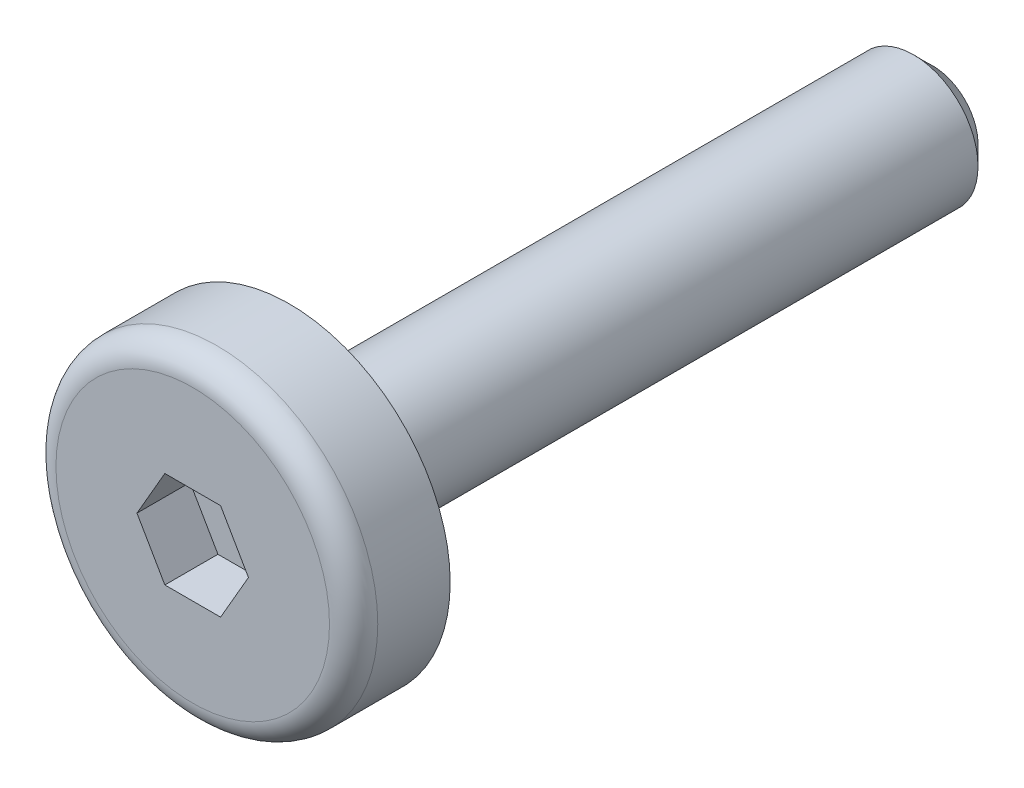
ISO-10303-21;
HEADER;
FILE_DESCRIPTION(('STEP AP214'),'2;1');
FILE_NAME('part.step','',(''),(''),'','','');
FILE_SCHEMA(('AUTOMOTIVE_DESIGN { 1 0 10303 214 1 1 1 1 }'));
ENDSEC;
DATA;
#1=APPLICATION_CONTEXT('core data for automotive mechanical design processes');
#2=APPLICATION_PROTOCOL_DEFINITION('international standard','automotive_design',2000,#1);
#3=PRODUCT_CONTEXT('',#1,'mechanical');
#4=PRODUCT('Part','Part','',(#3));
#5=PRODUCT_RELATED_PRODUCT_CATEGORY('part','',(#4));
#6=PRODUCT_DEFINITION_FORMATION('','',#4);
#7=PRODUCT_DEFINITION_CONTEXT('part definition',#1,'design');
#8=PRODUCT_DEFINITION('design','',#6,#7);
#9=PRODUCT_DEFINITION_SHAPE('','',#8);
#10=(LENGTH_UNIT() NAMED_UNIT(*) SI_UNIT(.MILLI.,.METRE.));
#11=(NAMED_UNIT(*) PLANE_ANGLE_UNIT() SI_UNIT($,.RADIAN.));
#12=(NAMED_UNIT(*) SI_UNIT($,.STERADIAN.) SOLID_ANGLE_UNIT());
#13=UNCERTAINTY_MEASURE_WITH_UNIT(LENGTH_MEASURE(1.E-05),#10,'distance_accuracy_value','');
#14=(GEOMETRIC_REPRESENTATION_CONTEXT(3) GLOBAL_UNCERTAINTY_ASSIGNED_CONTEXT((#13)) GLOBAL_UNIT_ASSIGNED_CONTEXT((#10,
#11,#12)) REPRESENTATION_CONTEXT('',''));
#15=CARTESIAN_POINT('',(0.,0.,0.));
#16=DIRECTION('',(0.,0.,1.));
#17=DIRECTION('',(1.,0.,0.));
#18=AXIS2_PLACEMENT_3D('',#15,#16,#17);
#19=CARTESIAN_POINT('',(0.,0.,-10.));
#20=DIRECTION('',(0.,0.,-1.));
#21=DIRECTION('',(-1.,0.,0.));
#22=AXIS2_PLACEMENT_3D('',#19,#20,#21);
#23=PLANE('',#22);
#24=CARTESIAN_POINT('',(0.,0.,-10.));
#25=DIRECTION('',(0.,0.,-1.));
#26=DIRECTION('',(-1.,0.,0.));
#27=AXIS2_PLACEMENT_3D('',#24,#25,#26);
#28=CIRCLE('',#27,0.699999999999999);
#29=CARTESIAN_POINT('',(-0.699999999999999,0.,-10.));
#30=VERTEX_POINT('',#29);
#31=EDGE_CURVE('E156',#30,#30,#28,.T.);
#32=ORIENTED_EDGE('',*,*,#31,.T.);
#33=EDGE_LOOP('',(#32));
#34=FACE_BOUND('',#33,.T.);
#35=ADVANCED_FACE('F40',(#34),#23,.T.);
#36=CARTESIAN_POINT('',(0.,0.,10.123));
#37=DIRECTION('',(0.,0.,1.));
#38=DIRECTION('',(1.,0.,0.));
#39=AXIS2_PLACEMENT_3D('',#36,#37,#38);
#40=CYLINDRICAL_SURFACE('',#39,1.);
#41=CARTESIAN_POINT('',(0.,0.,-9.7));
#42=DIRECTION('',(0.,0.,-1.));
#43=DIRECTION('',(-1.,0.,0.));
#44=AXIS2_PLACEMENT_3D('',#41,#42,#43);
#45=CIRCLE('',#44,1.);
#46=CARTESIAN_POINT('',(-1.,0.,-9.7));
#47=VERTEX_POINT('',#46);
#48=EDGE_CURVE('E153',#47,#47,#45,.F.);
#49=ORIENTED_EDGE('',*,*,#48,.T.);
#50=EDGE_LOOP('',(#49));
#51=FACE_BOUND('',#50,.T.);
#52=CARTESIAN_POINT('',(0.,0.,0.));
#53=DIRECTION('',(0.,0.,1.));
#54=DIRECTION('',(1.,0.,0.));
#55=AXIS2_PLACEMENT_3D('',#52,#53,#54);
#56=CIRCLE('',#55,1.);
#57=CARTESIAN_POINT('',(1.,0.,0.));
#58=VERTEX_POINT('',#57);
#59=EDGE_CURVE('E150',#58,#58,#56,.T.);
#60=ORIENTED_EDGE('',*,*,#59,.F.);
#61=EDGE_LOOP('',(#60));
#62=FACE_BOUND('',#61,.T.);
#63=ADVANCED_FACE('F176',(#51,#62),#40,.T.);
#64=CARTESIAN_POINT('',(1.,0.,0.));
#65=DIRECTION('',(0.,0.,-1.));
#66=DIRECTION('',(-1.,0.,0.));
#67=AXIS2_PLACEMENT_3D('',#64,#65,#66);
#68=PLANE('',#67);
#69=ORIENTED_EDGE('',*,*,#59,.T.);
#70=EDGE_LOOP('',(#69));
#71=FACE_BOUND('',#70,.T.);
#72=CARTESIAN_POINT('',(0.,0.,0.));
#73=DIRECTION('',(0.,0.,1.));
#74=DIRECTION('',(1.,0.,0.));
#75=AXIS2_PLACEMENT_3D('',#72,#73,#74);
#76=CIRCLE('',#75,2.5);
#77=CARTESIAN_POINT('',(2.5,0.,0.));
#78=VERTEX_POINT('',#77);
#79=EDGE_CURVE('E142',#78,#78,#76,.T.);
#80=ORIENTED_EDGE('',*,*,#79,.F.);
#81=EDGE_LOOP('',(#80));
#82=FACE_BOUND('',#81,.T.);
#83=ADVANCED_FACE('F182',(#71,#82),#68,.T.);
#84=CARTESIAN_POINT('',(0.,0.,10.123));
#85=DIRECTION('',(0.,0.,1.));
#86=DIRECTION('',(1.,0.,0.));
#87=AXIS2_PLACEMENT_3D('',#84,#85,#86);
#88=CYLINDRICAL_SURFACE('',#87,2.5);
#89=CARTESIAN_POINT('',(0.,0.,1.125));
#90=DIRECTION('',(0.,0.,1.));
#91=DIRECTION('',(1.,0.,0.));
#92=AXIS2_PLACEMENT_3D('',#89,#90,#91);
#93=CIRCLE('',#92,2.5);
#94=CARTESIAN_POINT('',(2.5,0.,1.125));
#95=VERTEX_POINT('',#94);
#96=EDGE_CURVE('E11',#95,#95,#93,.F.);
#97=ORIENTED_EDGE('',*,*,#96,.T.);
#98=EDGE_LOOP('',(#97));
#99=FACE_BOUND('',#98,.T.);
#100=ORIENTED_EDGE('',*,*,#79,.T.);
#101=EDGE_LOOP('',(#100));
#102=FACE_BOUND('',#101,.T.);
#103=ADVANCED_FACE('F191',(#99,#102),#88,.T.);
#104=CARTESIAN_POINT('',(2.5,0.,1.5));
#105=DIRECTION('',(0.,0.,1.));
#106=DIRECTION('',(1.,0.,0.));
#107=AXIS2_PLACEMENT_3D('',#104,#105,#106);
#108=PLANE('',#107);
#109=DIRECTION('',(0.499999999999995,0.866025403784442,0.));
#110=VECTOR('',#109,1.);
#111=CARTESIAN_POINT('',(0.433012701892228,-0.749999999999995,1.5));
#112=LINE('',#111,#110);
#113=CARTESIAN_POINT('',(0.433012701892228,-0.749999999999995,1.5));
#114=VERTEX_POINT('',#113);
#115=CARTESIAN_POINT('',(0.866025403784439,0.,1.5));
#116=VERTEX_POINT('',#115);
#117=EDGE_CURVE('E55',#114,#116,#112,.T.);
#118=ORIENTED_EDGE('',*,*,#117,.F.);
#119=DIRECTION('',(1.,0.,0.));
#120=VECTOR('',#119,1.);
#121=CARTESIAN_POINT('',(-0.433012701892212,-0.750000000000004,1.5));
#122=LINE('',#121,#120);
#123=CARTESIAN_POINT('',(-0.433012701892212,-0.750000000000004,1.5));
#124=VERTEX_POINT('',#123);
#125=EDGE_CURVE('E138',#124,#114,#122,.T.);
#126=ORIENTED_EDGE('',*,*,#125,.F.);
#127=DIRECTION('',(0.500000000000007,-0.866025403784434,0.));
#128=VECTOR('',#127,1.);
#129=CARTESIAN_POINT('',(-0.866025403784439,0.,1.5));
#130=LINE('',#129,#128);
#131=CARTESIAN_POINT('',(-0.866025403784439,0.,1.5));
#132=VERTEX_POINT('',#131);
#133=EDGE_CURVE('E136',#132,#124,#130,.T.);
#134=ORIENTED_EDGE('',*,*,#133,.F.);
#135=DIRECTION('',(-0.499999999999995,-0.866025403784442,0.));
#136=VECTOR('',#135,1.);
#137=CARTESIAN_POINT('',(-0.433012701892223,0.749999999999998,1.5));
#138=LINE('',#137,#136);
#139=CARTESIAN_POINT('',(-0.433012701892223,0.749999999999998,1.5));
#140=VERTEX_POINT('',#139);
#141=EDGE_CURVE('E103',#140,#132,#138,.T.);
#142=ORIENTED_EDGE('',*,*,#141,.F.);
#143=DIRECTION('',(-1.,0.,0.));
#144=VECTOR('',#143,1.);
#145=CARTESIAN_POINT('',(0.433012701892218,0.750000000000001,1.5));
#146=LINE('',#145,#144);
#147=CARTESIAN_POINT('',(0.433012701892218,0.750000000000001,1.5));
#148=VERTEX_POINT('',#147);
#149=EDGE_CURVE('E132',#148,#140,#146,.T.);
#150=ORIENTED_EDGE('',*,*,#149,.F.);
#151=DIRECTION('',(-0.500000000000001,0.866025403784438,0.));
#152=VECTOR('',#151,1.);
#153=CARTESIAN_POINT('',(0.866025403784439,0.,1.5));
#154=LINE('',#153,#152);
#155=EDGE_CURVE('E129',#116,#148,#154,.T.);
#156=ORIENTED_EDGE('',*,*,#155,.F.);
#157=EDGE_LOOP('',(#118,#126,#134,#142,#150,#156));
#158=FACE_BOUND('',#157,.T.);
#159=CARTESIAN_POINT('',(0.,0.,1.5));
#160=DIRECTION('',(0.,0.,1.));
#161=DIRECTION('',(1.,0.,0.));
#162=AXIS2_PLACEMENT_3D('',#159,#160,#161);
#163=CIRCLE('',#162,2.125);
#164=CARTESIAN_POINT('',(2.125,0.,1.5));
#165=VERTEX_POINT('',#164);
#166=EDGE_CURVE('E48',#165,#165,#163,.T.);
#167=ORIENTED_EDGE('',*,*,#166,.T.);
#168=EDGE_LOOP('',(#167));
#169=FACE_BOUND('',#168,.T.);
#170=ADVANCED_FACE('F161',(#158,#169),#108,.T.);
#171=CARTESIAN_POINT('',(0.,0.,-9.7));
#172=DIRECTION('',(0.,0.,1.));
#173=DIRECTION('',(1.,0.,0.));
#174=AXIS2_PLACEMENT_3D('',#171,#172,#173);
#175=CONICAL_SURFACE('',#174,1.,0.78539816339745);
#176=ORIENTED_EDGE('',*,*,#31,.F.);
#177=EDGE_LOOP('',(#176));
#178=FACE_BOUND('',#177,.T.);
#179=ORIENTED_EDGE('',*,*,#48,.F.);
#180=EDGE_LOOP('',(#179));
#181=FACE_BOUND('',#180,.T.);
#182=ADVANCED_FACE('F165',(#178,#181),#175,.T.);
#183=CARTESIAN_POINT('',(0.,0.,1.125));
#184=DIRECTION('',(0.,0.,1.));
#185=DIRECTION('',(1.,0.,0.));
#186=AXIS2_PLACEMENT_3D('',#183,#184,#185);
#187=TOROIDAL_SURFACE('',#186,2.125,0.375);
#188=ORIENTED_EDGE('',*,*,#96,.F.);
#189=EDGE_LOOP('',(#188));
#190=FACE_BOUND('',#189,.T.);
#191=ORIENTED_EDGE('',*,*,#166,.F.);
#192=EDGE_LOOP('',(#191));
#193=FACE_BOUND('',#192,.T.);
#194=ADVANCED_FACE('F42',(#190,#193),#187,.T.);
#195=CARTESIAN_POINT('',(0.433012701892228,-0.749999999999995,0.675));
#196=DIRECTION('',(0.866025403784441,-0.499999999999995,0.));
#197=DIRECTION('',(0.499999999999995,0.866025403784442,0.));
#198=AXIS2_PLACEMENT_3D('',#195,#196,#197);
#199=PLANE('',#198);
#200=ORIENTED_EDGE('',*,*,#117,.T.);
#201=DIRECTION('',(0.,0.,1.));
#202=VECTOR('',#201,1.);
#203=CARTESIAN_POINT('',(0.866025403784439,0.,0.675));
#204=LINE('',#203,#202);
#205=CARTESIAN_POINT('',(0.866025403784439,0.,0.675));
#206=VERTEX_POINT('',#205);
#207=EDGE_CURVE('E85',#206,#116,#204,.T.);
#208=ORIENTED_EDGE('',*,*,#207,.F.);
#209=DIRECTION('',(0.499999999999995,0.866025403784442,0.));
#210=VECTOR('',#209,1.);
#211=CARTESIAN_POINT('',(0.433012701892228,-0.749999999999995,0.675));
#212=LINE('',#211,#210);
#213=CARTESIAN_POINT('',(0.433012701892228,-0.749999999999995,0.675));
#214=VERTEX_POINT('',#213);
#215=EDGE_CURVE('E140',#214,#206,#212,.T.);
#216=ORIENTED_EDGE('',*,*,#215,.F.);
#217=DIRECTION('',(0.,0.,1.));
#218=VECTOR('',#217,1.);
#219=CARTESIAN_POINT('',(0.433012701892228,-0.749999999999995,0.675));
#220=LINE('',#219,#218);
#221=EDGE_CURVE('E63',#214,#114,#220,.T.);
#222=ORIENTED_EDGE('',*,*,#221,.T.);
#223=EDGE_LOOP('',(#200,#208,#216,#222));
#224=FACE_BOUND('',#223,.T.);
#225=ADVANCED_FACE('F164',(#224),#199,.F.);
#226=CARTESIAN_POINT('',(-0.433012701892212,-0.750000000000004,0.675));
#227=DIRECTION('',(0.,-1.,0.));
#228=DIRECTION('',(1.,0.,0.));
#229=AXIS2_PLACEMENT_3D('',#226,#227,#228);
#230=PLANE('',#229);
#231=ORIENTED_EDGE('',*,*,#125,.T.);
#232=ORIENTED_EDGE('',*,*,#221,.F.);
#233=DIRECTION('',(1.,0.,0.));
#234=VECTOR('',#233,1.);
#235=CARTESIAN_POINT('',(-0.433012701892212,-0.750000000000004,0.675));
#236=LINE('',#235,#234);
#237=CARTESIAN_POINT('',(-0.433012701892212,-0.750000000000004,0.675));
#238=VERTEX_POINT('',#237);
#239=EDGE_CURVE('E115',#238,#214,#236,.T.);
#240=ORIENTED_EDGE('',*,*,#239,.F.);
#241=DIRECTION('',(0.,0.,1.));
#242=VECTOR('',#241,1.);
#243=CARTESIAN_POINT('',(-0.433012701892212,-0.750000000000004,0.675));
#244=LINE('',#243,#242);
#245=EDGE_CURVE('E107',#238,#124,#244,.T.);
#246=ORIENTED_EDGE('',*,*,#245,.T.);
#247=EDGE_LOOP('',(#231,#232,#240,#246));
#248=FACE_BOUND('',#247,.T.);
#249=ADVANCED_FACE('F171',(#248),#230,.F.);
#250=CARTESIAN_POINT('',(-0.866025403784439,0.,0.675));
#251=DIRECTION('',(-0.866025403784435,-0.500000000000007,0.));
#252=DIRECTION('',(0.500000000000007,-0.866025403784434,0.));
#253=AXIS2_PLACEMENT_3D('',#250,#251,#252);
#254=PLANE('',#253);
#255=ORIENTED_EDGE('',*,*,#133,.T.);
#256=ORIENTED_EDGE('',*,*,#245,.F.);
#257=DIRECTION('',(0.500000000000007,-0.866025403784434,0.));
#258=VECTOR('',#257,1.);
#259=CARTESIAN_POINT('',(-0.866025403784439,0.,0.675));
#260=LINE('',#259,#258);
#261=CARTESIAN_POINT('',(-0.866025403784439,0.,0.675));
#262=VERTEX_POINT('',#261);
#263=EDGE_CURVE('E111',#262,#238,#260,.T.);
#264=ORIENTED_EDGE('',*,*,#263,.F.);
#265=DIRECTION('',(0.,0.,1.));
#266=VECTOR('',#265,1.);
#267=CARTESIAN_POINT('',(-0.866025403784439,0.,0.675));
#268=LINE('',#267,#266);
#269=EDGE_CURVE('E96',#262,#132,#268,.T.);
#270=ORIENTED_EDGE('',*,*,#269,.T.);
#271=EDGE_LOOP('',(#255,#256,#264,#270));
#272=FACE_BOUND('',#271,.T.);
#273=ADVANCED_FACE('F112',(#272),#254,.F.);
#274=CARTESIAN_POINT('',(-0.433012701892223,0.749999999999998,0.675));
#275=DIRECTION('',(-0.866025403784442,0.499999999999995,0.));
#276=DIRECTION('',(-0.499999999999995,-0.866025403784442,0.));
#277=AXIS2_PLACEMENT_3D('',#274,#275,#276);
#278=PLANE('',#277);
#279=ORIENTED_EDGE('',*,*,#141,.T.);
#280=ORIENTED_EDGE('',*,*,#269,.F.);
#281=DIRECTION('',(-0.499999999999995,-0.866025403784442,0.));
#282=VECTOR('',#281,1.);
#283=CARTESIAN_POINT('',(-0.433012701892223,0.749999999999998,0.675));
#284=LINE('',#283,#282);
#285=CARTESIAN_POINT('',(-0.433012701892223,0.749999999999998,0.675));
#286=VERTEX_POINT('',#285);
#287=EDGE_CURVE('E100',#286,#262,#284,.T.);
#288=ORIENTED_EDGE('',*,*,#287,.F.);
#289=DIRECTION('',(0.,0.,1.));
#290=VECTOR('',#289,1.);
#291=CARTESIAN_POINT('',(-0.433012701892223,0.749999999999998,0.675));
#292=LINE('',#291,#290);
#293=EDGE_CURVE('E108',#286,#140,#292,.T.);
#294=ORIENTED_EDGE('',*,*,#293,.T.);
#295=EDGE_LOOP('',(#279,#280,#288,#294));
#296=FACE_BOUND('',#295,.T.);
#297=ADVANCED_FACE('F98',(#296),#278,.F.);
#298=CARTESIAN_POINT('',(0.433012701892218,0.750000000000001,0.675));
#299=DIRECTION('',(0.,1.,0.));
#300=DIRECTION('',(-1.,0.,0.));
#301=AXIS2_PLACEMENT_3D('',#298,#299,#300);
#302=PLANE('',#301);
#303=ORIENTED_EDGE('',*,*,#149,.T.);
#304=ORIENTED_EDGE('',*,*,#293,.F.);
#305=DIRECTION('',(-1.,0.,0.));
#306=VECTOR('',#305,1.);
#307=CARTESIAN_POINT('',(0.433012701892218,0.750000000000001,0.675));
#308=LINE('',#307,#306);
#309=CARTESIAN_POINT('',(0.433012701892218,0.750000000000001,0.675));
#310=VERTEX_POINT('',#309);
#311=EDGE_CURVE('E121',#310,#286,#308,.T.);
#312=ORIENTED_EDGE('',*,*,#311,.F.);
#313=DIRECTION('',(0.,0.,1.));
#314=VECTOR('',#313,1.);
#315=CARTESIAN_POINT('',(0.433012701892218,0.750000000000001,0.675));
#316=LINE('',#315,#314);
#317=EDGE_CURVE('E145',#310,#148,#316,.T.);
#318=ORIENTED_EDGE('',*,*,#317,.T.);
#319=EDGE_LOOP('',(#303,#304,#312,#318));
#320=FACE_BOUND('',#319,.T.);
#321=ADVANCED_FACE('F202',(#320),#302,.F.);
#322=CARTESIAN_POINT('',(0.866025403784439,0.,0.675));
#323=DIRECTION('',(0.866025403784438,0.500000000000001,0.));
#324=DIRECTION('',(-0.500000000000001,0.866025403784438,0.));
#325=AXIS2_PLACEMENT_3D('',#322,#323,#324);
#326=PLANE('',#325);
#327=ORIENTED_EDGE('',*,*,#155,.T.);
#328=ORIENTED_EDGE('',*,*,#317,.F.);
#329=DIRECTION('',(-0.500000000000001,0.866025403784438,0.));
#330=VECTOR('',#329,1.);
#331=CARTESIAN_POINT('',(0.866025403784439,0.,0.675));
#332=LINE('',#331,#330);
#333=EDGE_CURVE('E123',#206,#310,#332,.T.);
#334=ORIENTED_EDGE('',*,*,#333,.F.);
#335=ORIENTED_EDGE('',*,*,#207,.T.);
#336=EDGE_LOOP('',(#327,#328,#334,#335));
#337=FACE_BOUND('',#336,.T.);
#338=ADVANCED_FACE('F199',(#337),#326,.F.);
#339=CARTESIAN_POINT('',(0.,0.,0.675));
#340=DIRECTION('',(0.,0.,1.));
#341=DIRECTION('',(1.,0.,0.));
#342=AXIS2_PLACEMENT_3D('',#339,#340,#341);
#343=PLANE('',#342);
#344=ORIENTED_EDGE('',*,*,#215,.T.);
#345=ORIENTED_EDGE('',*,*,#333,.T.);
#346=ORIENTED_EDGE('',*,*,#311,.T.);
#347=ORIENTED_EDGE('',*,*,#287,.T.);
#348=ORIENTED_EDGE('',*,*,#263,.T.);
#349=ORIENTED_EDGE('',*,*,#239,.T.);
#350=EDGE_LOOP('',(#344,#345,#346,#347,#348,#349));
#351=FACE_BOUND('',#350,.T.);
#352=ADVANCED_FACE('F118',(#351),#343,.T.);
#353=CLOSED_SHELL('',(#35,#63,#83,#103,#170,#182,#194,#225,#249,#273,#297,#321,#338,#352));
#354=MANIFOLD_SOLID_BREP('B2',#353);
#355=ADVANCED_BREP_SHAPE_REPRESENTATION('',(#18,#354),#14);
#356=SHAPE_DEFINITION_REPRESENTATION(#9,#355);
ENDSEC;
END-ISO-10303-21;
